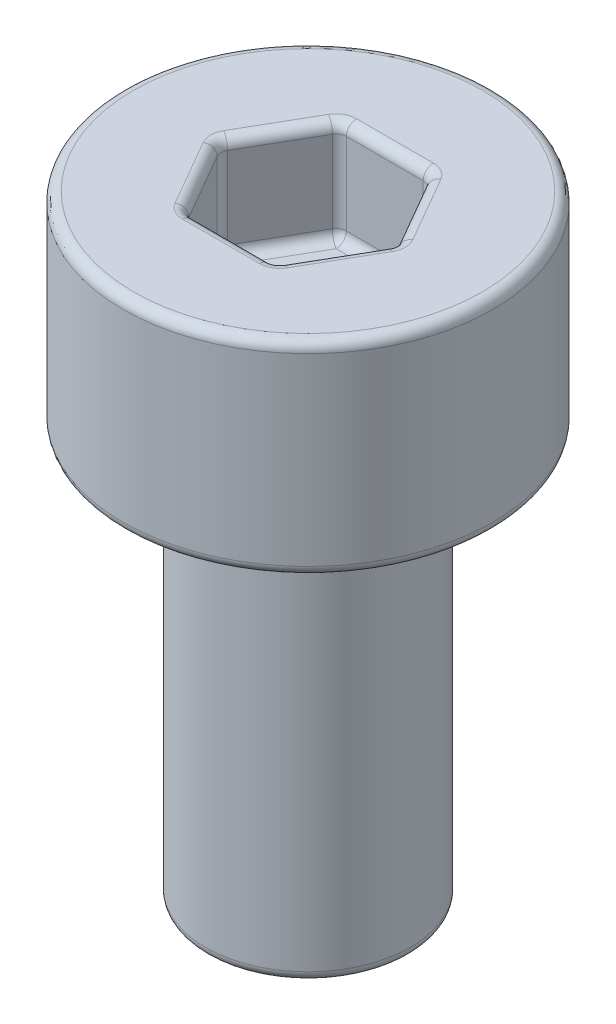
ISO-10303-21;
HEADER;
FILE_DESCRIPTION(('STEP AP214'),'2;1');
FILE_NAME('part.step','',(''),(''),'','','');
FILE_SCHEMA(('AUTOMOTIVE_DESIGN { 1 0 10303 214 1 1 1 1 }'));
ENDSEC;
DATA;
#1=APPLICATION_CONTEXT('core data for automotive mechanical design processes');
#2=APPLICATION_PROTOCOL_DEFINITION('international standard','automotive_design',2000,#1);
#3=PRODUCT_CONTEXT('',#1,'mechanical');
#4=PRODUCT('Part','Part','',(#3));
#5=PRODUCT_RELATED_PRODUCT_CATEGORY('part','',(#4));
#6=PRODUCT_DEFINITION_FORMATION('','',#4);
#7=PRODUCT_DEFINITION_CONTEXT('part definition',#1,'design');
#8=PRODUCT_DEFINITION('design','',#6,#7);
#9=PRODUCT_DEFINITION_SHAPE('','',#8);
#10=(LENGTH_UNIT() NAMED_UNIT(*) SI_UNIT(.MILLI.,.METRE.));
#11=(NAMED_UNIT(*) PLANE_ANGLE_UNIT() SI_UNIT($,.RADIAN.));
#12=(NAMED_UNIT(*) SI_UNIT($,.STERADIAN.) SOLID_ANGLE_UNIT());
#13=UNCERTAINTY_MEASURE_WITH_UNIT(LENGTH_MEASURE(1.E-05),#10,'distance_accuracy_value','');
#14=(GEOMETRIC_REPRESENTATION_CONTEXT(3) GLOBAL_UNCERTAINTY_ASSIGNED_CONTEXT((#13)) GLOBAL_UNIT_ASSIGNED_CONTEXT((#10,
#11,#12)) REPRESENTATION_CONTEXT('',''));
#15=CARTESIAN_POINT('',(0.,0.,0.));
#16=DIRECTION('',(0.,0.,1.));
#17=DIRECTION('',(1.,0.,0.));
#18=AXIS2_PLACEMENT_3D('',#15,#16,#17);
#19=CARTESIAN_POINT('',(0.,4.,0.));
#20=DIRECTION('',(0.,1.,0.));
#21=DIRECTION('',(0.,0.,1.));
#22=AXIS2_PLACEMENT_3D('',#19,#20,#21);
#23=PLANE('',#22);
#24=CARTESIAN_POINT('',(0.,4.,0.));
#25=DIRECTION('',(0.,1.,0.));
#26=DIRECTION('',(0.,0.,1.));
#27=AXIS2_PLACEMENT_3D('',#24,#25,#26);
#28=CIRCLE('',#27,3.41);
#29=CARTESIAN_POINT('',(0.,4.,3.41));
#30=VERTEX_POINT('',#29);
#31=EDGE_CURVE('E232',#30,#30,#28,.T.);
#32=ORIENTED_EDGE('',*,*,#31,.T.);
#33=EDGE_LOOP('',(#32));
#34=FACE_BOUND('',#33,.T.);
#35=CARTESIAN_POINT('',(0.750555349946514,4.,1.3));
#36=DIRECTION('',(0.,1.,0.));
#37=DIRECTION('',(0.,0.,1.));
#38=AXIS2_PLACEMENT_3D('',#35,#36,#37);
#39=CIRCLE('',#38,0.4);
#40=CARTESIAN_POINT('',(0.750555349946514,4.,1.7));
#41=VERTEX_POINT('',#40);
#42=CARTESIAN_POINT('',(1.09696551146029,4.,1.5));
#43=VERTEX_POINT('',#42);
#44=EDGE_CURVE('E262',#41,#43,#39,.T.);
#45=ORIENTED_EDGE('',*,*,#44,.F.);
#46=DIRECTION('',(1.,0.,0.));
#47=VECTOR('',#46,1.);
#48=CARTESIAN_POINT('',(-0.866025403784439,4.,1.7));
#49=LINE('',#48,#47);
#50=CARTESIAN_POINT('',(-0.750555349946514,4.,1.7));
#51=VERTEX_POINT('',#50);
#52=EDGE_CURVE('E260',#41,#51,#49,.F.);
#53=ORIENTED_EDGE('',*,*,#52,.T.);
#54=CARTESIAN_POINT('',(-0.750555349946514,4.,1.3));
#55=DIRECTION('',(0.,1.,0.));
#56=DIRECTION('',(0.,0.,1.));
#57=AXIS2_PLACEMENT_3D('',#54,#55,#56);
#58=CIRCLE('',#57,0.4);
#59=CARTESIAN_POINT('',(-1.09696551146029,4.,1.5));
#60=VERTEX_POINT('',#59);
#61=EDGE_CURVE('E257',#60,#51,#58,.T.);
#62=ORIENTED_EDGE('',*,*,#61,.F.);
#63=DIRECTION('',(0.5,0.,0.866025403784439));
#64=VECTOR('',#63,1.);
#65=CARTESIAN_POINT('',(-1.90525588832577,4.,0.1));
#66=LINE('',#65,#64);
#67=CARTESIAN_POINT('',(-1.8475208614068,4.,0.2));
#68=VERTEX_POINT('',#67);
#69=EDGE_CURVE('E249',#60,#68,#66,.F.);
#70=ORIENTED_EDGE('',*,*,#69,.T.);
#71=CARTESIAN_POINT('',(-1.50111069989303,4.,0.));
#72=DIRECTION('',(0.,1.,0.));
#73=DIRECTION('',(0.,0.,1.));
#74=AXIS2_PLACEMENT_3D('',#71,#72,#73);
#75=CIRCLE('',#74,0.4);
#76=CARTESIAN_POINT('',(-1.8475208614068,4.,-0.2));
#77=VERTEX_POINT('',#76);
#78=EDGE_CURVE('E247',#77,#68,#75,.T.);
#79=ORIENTED_EDGE('',*,*,#78,.F.);
#80=DIRECTION('',(-0.5,0.,0.866025403784439));
#81=VECTOR('',#80,1.);
#82=CARTESIAN_POINT('',(-1.03923048454133,4.,-1.6));
#83=LINE('',#82,#81);
#84=CARTESIAN_POINT('',(-1.09696551146029,4.,-1.5));
#85=VERTEX_POINT('',#84);
#86=EDGE_CURVE('E243',#77,#85,#83,.F.);
#87=ORIENTED_EDGE('',*,*,#86,.T.);
#88=CARTESIAN_POINT('',(-0.750555349946514,4.,-1.3));
#89=DIRECTION('',(0.,1.,0.));
#90=DIRECTION('',(0.,0.,1.));
#91=AXIS2_PLACEMENT_3D('',#88,#89,#90);
#92=CIRCLE('',#91,0.4);
#93=CARTESIAN_POINT('',(-0.750555349946514,4.,-1.7));
#94=VERTEX_POINT('',#93);
#95=EDGE_CURVE('E240',#94,#85,#92,.T.);
#96=ORIENTED_EDGE('',*,*,#95,.F.);
#97=DIRECTION('',(-1.,0.,0.));
#98=VECTOR('',#97,1.);
#99=CARTESIAN_POINT('',(0.866025403784438,4.,-1.7));
#100=LINE('',#99,#98);
#101=CARTESIAN_POINT('',(0.750555349946513,4.,-1.7));
#102=VERTEX_POINT('',#101);
#103=EDGE_CURVE('E238',#94,#102,#100,.F.);
#104=ORIENTED_EDGE('',*,*,#103,.T.);
#105=CARTESIAN_POINT('',(0.750555349946513,4.,-1.3));
#106=DIRECTION('',(0.,1.,0.));
#107=DIRECTION('',(0.,0.,1.));
#108=AXIS2_PLACEMENT_3D('',#105,#106,#107);
#109=CIRCLE('',#108,0.4);
#110=CARTESIAN_POINT('',(1.09696551146029,4.,-1.5));
#111=VERTEX_POINT('',#110);
#112=EDGE_CURVE('E235',#111,#102,#109,.T.);
#113=ORIENTED_EDGE('',*,*,#112,.F.);
#114=DIRECTION('',(-0.5,0.,-0.866025403784439));
#115=VECTOR('',#114,1.);
#116=CARTESIAN_POINT('',(1.90525588832576,4.,-0.1));
#117=LINE('',#116,#115);
#118=CARTESIAN_POINT('',(1.8475208614068,4.,-0.200000000000001));
#119=VERTEX_POINT('',#118);
#120=EDGE_CURVE('E245',#111,#119,#117,.F.);
#121=ORIENTED_EDGE('',*,*,#120,.T.);
#122=CARTESIAN_POINT('',(1.50111069989303,4.,0.));
#123=DIRECTION('',(0.,1.,0.));
#124=DIRECTION('',(0.,0.,1.));
#125=AXIS2_PLACEMENT_3D('',#122,#123,#124);
#126=CIRCLE('',#125,0.4);
#127=CARTESIAN_POINT('',(1.8475208614068,4.,0.199999999999999));
#128=VERTEX_POINT('',#127);
#129=EDGE_CURVE('E252',#128,#119,#126,.T.);
#130=ORIENTED_EDGE('',*,*,#129,.F.);
#131=DIRECTION('',(0.5,0.,-0.866025403784439));
#132=VECTOR('',#131,1.);
#133=CARTESIAN_POINT('',(1.03923048454133,4.,1.6));
#134=LINE('',#133,#132);
#135=EDGE_CURVE('E255',#128,#43,#134,.F.);
#136=ORIENTED_EDGE('',*,*,#135,.T.);
#137=EDGE_LOOP('',(#45,#53,#62,#70,#79,#87,#96,#104,#113,#121,#130,#136));
#138=FACE_BOUND('',#137,.T.);
#139=ADVANCED_FACE('F32',(#34,#138),#23,.T.);
#140=CARTESIAN_POINT('',(0.,-8.,0.));
#141=DIRECTION('',(0.,1.,0.));
#142=DIRECTION('',(0.,0.,1.));
#143=AXIS2_PLACEMENT_3D('',#140,#141,#142);
#144=CYLINDRICAL_SURFACE('',#143,2.);
#145=CARTESIAN_POINT('',(0.,-7.8,0.));
#146=DIRECTION('',(0.,1.,0.));
#147=DIRECTION('',(0.,0.,1.));
#148=AXIS2_PLACEMENT_3D('',#145,#146,#147);
#149=CIRCLE('',#148,2.);
#150=CARTESIAN_POINT('',(0.,-7.8,2.));
#151=VERTEX_POINT('',#150);
#152=EDGE_CURVE('E306',#151,#151,#149,.T.);
#153=ORIENTED_EDGE('',*,*,#152,.T.);
#154=EDGE_LOOP('',(#153));
#155=FACE_BOUND('',#154,.T.);
#156=CARTESIAN_POINT('',(0.,0.,0.));
#157=DIRECTION('',(0.,1.,0.));
#158=DIRECTION('',(0.,0.,1.));
#159=AXIS2_PLACEMENT_3D('',#156,#157,#158);
#160=CIRCLE('',#159,2.);
#161=CARTESIAN_POINT('',(0.,0.,2.));
#162=VERTEX_POINT('',#161);
#163=EDGE_CURVE('E211',#162,#162,#160,.T.);
#164=ORIENTED_EDGE('',*,*,#163,.F.);
#165=EDGE_LOOP('',(#164));
#166=FACE_BOUND('',#165,.T.);
#167=ADVANCED_FACE('F483',(#155,#166),#144,.T.);
#168=CARTESIAN_POINT('',(0.,-8.,0.));
#169=DIRECTION('',(0.,1.,0.));
#170=DIRECTION('',(0.,0.,1.));
#171=AXIS2_PLACEMENT_3D('',#168,#169,#170);
#172=PLANE('',#171);
#173=CARTESIAN_POINT('',(0.,-8.,0.));
#174=DIRECTION('',(0.,1.,0.));
#175=DIRECTION('',(0.,0.,1.));
#176=AXIS2_PLACEMENT_3D('',#173,#174,#175);
#177=CIRCLE('',#176,1.8);
#178=CARTESIAN_POINT('',(0.,-8.,1.8));
#179=VERTEX_POINT('',#178);
#180=EDGE_CURVE('E309',#179,#179,#177,.F.);
#181=ORIENTED_EDGE('',*,*,#180,.T.);
#182=EDGE_LOOP('',(#181));
#183=FACE_BOUND('',#182,.T.);
#184=ADVANCED_FACE('F489',(#183),#172,.F.);
#185=CARTESIAN_POINT('',(0.,4.,0.));
#186=DIRECTION('',(0.,-1.,0.));
#187=DIRECTION('',(0.,0.,-1.));
#188=AXIS2_PLACEMENT_3D('',#185,#186,#187);
#189=CYLINDRICAL_SURFACE('',#188,3.61);
#190=CARTESIAN_POINT('',(0.,0.2,0.));
#191=DIRECTION('',(0.,1.,0.));
#192=DIRECTION('',(0.,0.,1.));
#193=AXIS2_PLACEMENT_3D('',#190,#191,#192);
#194=CIRCLE('',#193,3.61);
#195=CARTESIAN_POINT('',(0.,0.2,3.61));
#196=VERTEX_POINT('',#195);
#197=EDGE_CURVE('E41',#196,#196,#194,.T.);
#198=ORIENTED_EDGE('',*,*,#197,.T.);
#199=EDGE_LOOP('',(#198));
#200=FACE_BOUND('',#199,.T.);
#201=CARTESIAN_POINT('',(0.,3.8,0.));
#202=DIRECTION('',(0.,1.,0.));
#203=DIRECTION('',(0.,0.,1.));
#204=AXIS2_PLACEMENT_3D('',#201,#202,#203);
#205=CIRCLE('',#204,3.61);
#206=CARTESIAN_POINT('',(0.,3.8,3.61));
#207=VERTEX_POINT('',#206);
#208=EDGE_CURVE('E312',#207,#207,#205,.F.);
#209=ORIENTED_EDGE('',*,*,#208,.T.);
#210=EDGE_LOOP('',(#209));
#211=FACE_BOUND('',#210,.T.);
#212=ADVANCED_FACE('F498',(#200,#211),#189,.T.);
#213=CARTESIAN_POINT('',(0.,0.,0.));
#214=DIRECTION('',(0.,1.,0.));
#215=DIRECTION('',(0.,0.,1.));
#216=AXIS2_PLACEMENT_3D('',#213,#214,#215);
#217=PLANE('',#216);
#218=CARTESIAN_POINT('',(0.,0.,0.));
#219=DIRECTION('',(0.,1.,0.));
#220=DIRECTION('',(0.,0.,1.));
#221=AXIS2_PLACEMENT_3D('',#218,#219,#220);
#222=CIRCLE('',#221,3.41);
#223=CARTESIAN_POINT('',(0.,0.,3.41));
#224=VERTEX_POINT('',#223);
#225=EDGE_CURVE('E11',#224,#224,#222,.F.);
#226=ORIENTED_EDGE('',*,*,#225,.T.);
#227=EDGE_LOOP('',(#226));
#228=FACE_BOUND('',#227,.T.);
#229=ORIENTED_EDGE('',*,*,#163,.T.);
#230=EDGE_LOOP('',(#229));
#231=FACE_BOUND('',#230,.T.);
#232=ADVANCED_FACE('F495',(#228,#231),#217,.F.);
#233=CARTESIAN_POINT('',(0.866025403784439,2.,1.5));
#234=DIRECTION('',(0.866025403784439,0.,0.499999999999999));
#235=DIRECTION('',(0.5,0.,-0.866025403784439));
#236=AXIS2_PLACEMENT_3D('',#233,#234,#235);
#237=PLANE('',#236);
#238=DIRECTION('',(0.5,0.,-0.866025403784439));
#239=VECTOR('',#238,1.);
#240=CARTESIAN_POINT('',(0.866025403784439,2.2,1.5));
#241=LINE('',#240,#239);
#242=CARTESIAN_POINT('',(1.67431578064991,2.2,0.0999999999999996));
#243=VERTEX_POINT('',#242);
#244=CARTESIAN_POINT('',(0.923760430703402,2.2,1.4));
#245=VERTEX_POINT('',#244);
#246=EDGE_CURVE('E278',#243,#245,#241,.F.);
#247=ORIENTED_EDGE('',*,*,#246,.T.);
#248=DIRECTION('',(0.,1.,0.));
#249=VECTOR('',#248,1.);
#250=CARTESIAN_POINT('',(0.923760430703402,4.,1.4));
#251=LINE('',#250,#249);
#252=CARTESIAN_POINT('',(0.923760430703402,3.8,1.4));
#253=VERTEX_POINT('',#252);
#254=EDGE_CURVE('E280',#245,#253,#251,.T.);
#255=ORIENTED_EDGE('',*,*,#254,.T.);
#256=DIRECTION('',(0.5,0.,-0.866025403784439));
#257=VECTOR('',#256,1.);
#258=CARTESIAN_POINT('',(1.73205080756888,3.8,0.));
#259=LINE('',#258,#257);
#260=CARTESIAN_POINT('',(1.67431578064991,3.8,0.0999999999999996));
#261=VERTEX_POINT('',#260);
#262=EDGE_CURVE('E276',#253,#261,#259,.T.);
#263=ORIENTED_EDGE('',*,*,#262,.T.);
#264=DIRECTION('',(0.,1.,0.));
#265=VECTOR('',#264,1.);
#266=CARTESIAN_POINT('',(1.67431578064991,2.,0.0999999999999996));
#267=LINE('',#266,#265);
#268=EDGE_CURVE('E274',#261,#243,#267,.F.);
#269=ORIENTED_EDGE('',*,*,#268,.T.);
#270=EDGE_LOOP('',(#247,#255,#263,#269));
#271=FACE_BOUND('',#270,.T.);
#272=ADVANCED_FACE('F494',(#271),#237,.F.);
#273=CARTESIAN_POINT('',(-0.866025403784439,2.,1.5));
#274=DIRECTION('',(0.,0.,1.));
#275=DIRECTION('',(1.,0.,0.));
#276=AXIS2_PLACEMENT_3D('',#273,#274,#275);
#277=PLANE('',#276);
#278=DIRECTION('',(1.,0.,0.));
#279=VECTOR('',#278,1.);
#280=CARTESIAN_POINT('',(-0.866025403784439,2.2,1.5));
#281=LINE('',#280,#279);
#282=CARTESIAN_POINT('',(0.750555349946514,2.2,1.5));
#283=VERTEX_POINT('',#282);
#284=CARTESIAN_POINT('',(-0.750555349946514,2.2,1.5));
#285=VERTEX_POINT('',#284);
#286=EDGE_CURVE('E269',#283,#285,#281,.F.);
#287=ORIENTED_EDGE('',*,*,#286,.T.);
#288=DIRECTION('',(0.,1.,0.));
#289=VECTOR('',#288,1.);
#290=CARTESIAN_POINT('',(-0.750555349946514,4.,1.5));
#291=LINE('',#290,#289);
#292=CARTESIAN_POINT('',(-0.750555349946514,3.8,1.5));
#293=VERTEX_POINT('',#292);
#294=EDGE_CURVE('E271',#285,#293,#291,.T.);
#295=ORIENTED_EDGE('',*,*,#294,.T.);
#296=DIRECTION('',(1.,0.,0.));
#297=VECTOR('',#296,1.);
#298=CARTESIAN_POINT('',(0.866025403784439,3.8,1.5));
#299=LINE('',#298,#297);
#300=CARTESIAN_POINT('',(0.750555349946514,3.8,1.5));
#301=VERTEX_POINT('',#300);
#302=EDGE_CURVE('E267',#293,#301,#299,.T.);
#303=ORIENTED_EDGE('',*,*,#302,.T.);
#304=DIRECTION('',(0.,1.,0.));
#305=VECTOR('',#304,1.);
#306=CARTESIAN_POINT('',(0.750555349946514,2.,1.5));
#307=LINE('',#306,#305);
#308=EDGE_CURVE('E265',#301,#283,#307,.F.);
#309=ORIENTED_EDGE('',*,*,#308,.T.);
#310=EDGE_LOOP('',(#287,#295,#303,#309));
#311=FACE_BOUND('',#310,.T.);
#312=ADVANCED_FACE('F835',(#311),#277,.F.);
#313=CARTESIAN_POINT('',(-1.73205080756888,2.,0.));
#314=DIRECTION('',(-0.866025403784439,0.,0.5));
#315=DIRECTION('',(0.5,0.,0.866025403784439));
#316=AXIS2_PLACEMENT_3D('',#313,#314,#315);
#317=PLANE('',#316);
#318=DIRECTION('',(0.5,0.,0.866025403784439));
#319=VECTOR('',#318,1.);
#320=CARTESIAN_POINT('',(-0.866025403784439,3.8,1.5));
#321=LINE('',#320,#319);
#322=CARTESIAN_POINT('',(-1.67431578064992,3.8,0.1));
#323=VERTEX_POINT('',#322);
#324=CARTESIAN_POINT('',(-0.923760430703402,3.8,1.4));
#325=VERTEX_POINT('',#324);
#326=EDGE_CURVE('E225',#323,#325,#321,.T.);
#327=ORIENTED_EDGE('',*,*,#326,.T.);
#328=DIRECTION('',(0.,1.,0.));
#329=VECTOR('',#328,1.);
#330=CARTESIAN_POINT('',(-0.923760430703402,2.,1.4));
#331=LINE('',#330,#329);
#332=CARTESIAN_POINT('',(-0.923760430703402,2.2,1.4));
#333=VERTEX_POINT('',#332);
#334=EDGE_CURVE('E230',#325,#333,#331,.F.);
#335=ORIENTED_EDGE('',*,*,#334,.T.);
#336=DIRECTION('',(0.5,0.,0.866025403784439));
#337=VECTOR('',#336,1.);
#338=CARTESIAN_POINT('',(-1.73205080756888,2.2,0.));
#339=LINE('',#338,#337);
#340=CARTESIAN_POINT('',(-1.67431578064992,2.2,0.1));
#341=VERTEX_POINT('',#340);
#342=EDGE_CURVE('E227',#333,#341,#339,.F.);
#343=ORIENTED_EDGE('',*,*,#342,.T.);
#344=DIRECTION('',(0.,1.,0.));
#345=VECTOR('',#344,1.);
#346=CARTESIAN_POINT('',(-1.67431578064992,4.,0.1));
#347=LINE('',#346,#345);
#348=EDGE_CURVE('E223',#341,#323,#347,.T.);
#349=ORIENTED_EDGE('',*,*,#348,.T.);
#350=EDGE_LOOP('',(#327,#335,#343,#349));
#351=FACE_BOUND('',#350,.T.);
#352=ADVANCED_FACE('F479',(#351),#317,.F.);
#353=CARTESIAN_POINT('',(-0.866025403784439,2.,-1.5));
#354=DIRECTION('',(-0.866025403784439,0.,-0.5));
#355=DIRECTION('',(-0.5,0.,0.866025403784439));
#356=AXIS2_PLACEMENT_3D('',#353,#354,#355);
#357=PLANE('',#356);
#358=DIRECTION('',(0.,1.,0.));
#359=VECTOR('',#358,1.);
#360=CARTESIAN_POINT('',(-1.67431578064992,2.,-0.0999999999999996));
#361=LINE('',#360,#359);
#362=CARTESIAN_POINT('',(-1.67431578064992,3.8,-0.0999999999999996));
#363=VERTEX_POINT('',#362);
#364=CARTESIAN_POINT('',(-1.67431578064992,2.2,-0.0999999999999996));
#365=VERTEX_POINT('',#364);
#366=EDGE_CURVE('E295',#363,#365,#361,.F.);
#367=ORIENTED_EDGE('',*,*,#366,.T.);
#368=DIRECTION('',(-0.5,0.,0.866025403784439));
#369=VECTOR('',#368,1.);
#370=CARTESIAN_POINT('',(-0.866025403784439,2.2,-1.5));
#371=LINE('',#370,#369);
#372=CARTESIAN_POINT('',(-0.923760430703402,2.2,-1.4));
#373=VERTEX_POINT('',#372);
#374=EDGE_CURVE('E297',#365,#373,#371,.F.);
#375=ORIENTED_EDGE('',*,*,#374,.T.);
#376=DIRECTION('',(0.,1.,0.));
#377=VECTOR('',#376,1.);
#378=CARTESIAN_POINT('',(-0.923760430703402,4.,-1.4));
#379=LINE('',#378,#377);
#380=CARTESIAN_POINT('',(-0.923760430703402,3.8,-1.4));
#381=VERTEX_POINT('',#380);
#382=EDGE_CURVE('E291',#373,#381,#379,.T.);
#383=ORIENTED_EDGE('',*,*,#382,.T.);
#384=DIRECTION('',(-0.5,0.,0.866025403784439));
#385=VECTOR('',#384,1.);
#386=CARTESIAN_POINT('',(-1.73205080756888,3.8,0.));
#387=LINE('',#386,#385);
#388=EDGE_CURVE('E293',#381,#363,#387,.T.);
#389=ORIENTED_EDGE('',*,*,#388,.T.);
#390=EDGE_LOOP('',(#367,#375,#383,#389));
#391=FACE_BOUND('',#390,.T.);
#392=ADVANCED_FACE('F472',(#391),#357,.F.);
#393=CARTESIAN_POINT('',(0.866025403784438,2.,-1.5));
#394=DIRECTION('',(0.,0.,-1.));
#395=DIRECTION('',(-1.,0.,0.));
#396=AXIS2_PLACEMENT_3D('',#393,#394,#395);
#397=PLANE('',#396);
#398=DIRECTION('',(-1.,0.,0.));
#399=VECTOR('',#398,1.);
#400=CARTESIAN_POINT('',(0.866025403784438,2.2,-1.5));
#401=LINE('',#400,#399);
#402=CARTESIAN_POINT('',(-0.750555349946514,2.2,-1.5));
#403=VERTEX_POINT('',#402);
#404=CARTESIAN_POINT('',(0.750555349946513,2.2,-1.5));
#405=VERTEX_POINT('',#404);
#406=EDGE_CURVE('E49',#403,#405,#401,.F.);
#407=ORIENTED_EDGE('',*,*,#406,.T.);
#408=DIRECTION('',(0.,1.,0.));
#409=VECTOR('',#408,1.);
#410=CARTESIAN_POINT('',(0.750555349946513,4.,-1.5));
#411=LINE('',#410,#409);
#412=CARTESIAN_POINT('',(0.750555349946513,3.8,-1.5));
#413=VERTEX_POINT('',#412);
#414=EDGE_CURVE('E304',#405,#413,#411,.T.);
#415=ORIENTED_EDGE('',*,*,#414,.T.);
#416=DIRECTION('',(-1.,0.,0.));
#417=VECTOR('',#416,1.);
#418=CARTESIAN_POINT('',(-0.866025403784439,3.8,-1.5));
#419=LINE('',#418,#417);
#420=CARTESIAN_POINT('',(-0.750555349946514,3.8,-1.5));
#421=VERTEX_POINT('',#420);
#422=EDGE_CURVE('E300',#413,#421,#419,.T.);
#423=ORIENTED_EDGE('',*,*,#422,.T.);
#424=DIRECTION('',(0.,1.,0.));
#425=VECTOR('',#424,1.);
#426=CARTESIAN_POINT('',(-0.750555349946514,2.,-1.5));
#427=LINE('',#426,#425);
#428=EDGE_CURVE('E54',#421,#403,#427,.F.);
#429=ORIENTED_EDGE('',*,*,#428,.T.);
#430=EDGE_LOOP('',(#407,#415,#423,#429));
#431=FACE_BOUND('',#430,.T.);
#432=ADVANCED_FACE('F470',(#431),#397,.F.);
#433=CARTESIAN_POINT('',(1.73205080756888,2.,0.));
#434=DIRECTION('',(0.866025403784439,0.,-0.5));
#435=DIRECTION('',(-0.5,0.,-0.866025403784439));
#436=AXIS2_PLACEMENT_3D('',#433,#434,#435);
#437=PLANE('',#436);
#438=DIRECTION('',(-0.5,0.,-0.866025403784439));
#439=VECTOR('',#438,1.);
#440=CARTESIAN_POINT('',(1.73205080756888,2.2,0.));
#441=LINE('',#440,#439);
#442=CARTESIAN_POINT('',(0.923760430703401,2.2,-1.4));
#443=VERTEX_POINT('',#442);
#444=CARTESIAN_POINT('',(1.67431578064991,2.2,-0.100000000000001));
#445=VERTEX_POINT('',#444);
#446=EDGE_CURVE('E193',#443,#445,#441,.F.);
#447=ORIENTED_EDGE('',*,*,#446,.T.);
#448=DIRECTION('',(0.,1.,0.));
#449=VECTOR('',#448,1.);
#450=CARTESIAN_POINT('',(1.67431578064991,4.,-0.1));
#451=LINE('',#450,#449);
#452=CARTESIAN_POINT('',(1.67431578064991,3.8,-0.100000000000001));
#453=VERTEX_POINT('',#452);
#454=EDGE_CURVE('E288',#445,#453,#451,.T.);
#455=ORIENTED_EDGE('',*,*,#454,.T.);
#456=DIRECTION('',(-0.5,0.,-0.866025403784439));
#457=VECTOR('',#456,1.);
#458=CARTESIAN_POINT('',(0.866025403784438,3.8,-1.5));
#459=LINE('',#458,#457);
#460=CARTESIAN_POINT('',(0.923760430703401,3.8,-1.4));
#461=VERTEX_POINT('',#460);
#462=EDGE_CURVE('E285',#453,#461,#459,.T.);
#463=ORIENTED_EDGE('',*,*,#462,.T.);
#464=DIRECTION('',(0.,1.,0.));
#465=VECTOR('',#464,1.);
#466=CARTESIAN_POINT('',(0.923760430703401,2.,-1.4));
#467=LINE('',#466,#465);
#468=EDGE_CURVE('E283',#461,#443,#467,.F.);
#469=ORIENTED_EDGE('',*,*,#468,.T.);
#470=EDGE_LOOP('',(#447,#455,#463,#469));
#471=FACE_BOUND('',#470,.T.);
#472=ADVANCED_FACE('F467',(#471),#437,.F.);
#473=CARTESIAN_POINT('',(0.,2.,0.));
#474=DIRECTION('',(0.,1.,0.));
#475=DIRECTION('',(0.,0.,1.));
#476=AXIS2_PLACEMENT_3D('',#473,#474,#475);
#477=PLANE('',#476);
#478=DIRECTION('',(-0.5,0.,0.866025403784439));
#479=VECTOR('',#478,1.);
#480=CARTESIAN_POINT('',(-1.12583302491977,2.,-0.65));
#481=LINE('',#480,#479);
#482=CARTESIAN_POINT('',(-0.750555349946514,2.,-1.3));
#483=VERTEX_POINT('',#482);
#484=CARTESIAN_POINT('',(-1.50111069989303,2.,0.));
#485=VERTEX_POINT('',#484);
#486=EDGE_CURVE('E186',#483,#485,#481,.T.);
#487=ORIENTED_EDGE('',*,*,#486,.T.);
#488=DIRECTION('',(0.5,0.,0.866025403784439));
#489=VECTOR('',#488,1.);
#490=CARTESIAN_POINT('',(-1.12583302491977,2.,0.65));
#491=LINE('',#490,#489);
#492=CARTESIAN_POINT('',(-0.750555349946514,2.,1.3));
#493=VERTEX_POINT('',#492);
#494=EDGE_CURVE('E220',#485,#493,#491,.T.);
#495=ORIENTED_EDGE('',*,*,#494,.T.);
#496=DIRECTION('',(1.,0.,0.));
#497=VECTOR('',#496,1.);
#498=CARTESIAN_POINT('',(0.,2.,1.3));
#499=LINE('',#498,#497);
#500=CARTESIAN_POINT('',(0.750555349946514,2.,1.3));
#501=VERTEX_POINT('',#500);
#502=EDGE_CURVE('E218',#493,#501,#499,.T.);
#503=ORIENTED_EDGE('',*,*,#502,.T.);
#504=DIRECTION('',(0.5,0.,-0.866025403784439));
#505=VECTOR('',#504,1.);
#506=CARTESIAN_POINT('',(1.12583302491977,2.,0.649999999999999));
#507=LINE('',#506,#505);
#508=CARTESIAN_POINT('',(1.50111069989303,2.,0.));
#509=VERTEX_POINT('',#508);
#510=EDGE_CURVE('E182',#501,#509,#507,.T.);
#511=ORIENTED_EDGE('',*,*,#510,.T.);
#512=DIRECTION('',(-0.5,0.,-0.866025403784439));
#513=VECTOR('',#512,1.);
#514=CARTESIAN_POINT('',(1.12583302491977,2.,-0.65));
#515=LINE('',#514,#513);
#516=CARTESIAN_POINT('',(0.750555349946513,2.,-1.3));
#517=VERTEX_POINT('',#516);
#518=EDGE_CURVE('E175',#509,#517,#515,.T.);
#519=ORIENTED_EDGE('',*,*,#518,.T.);
#520=DIRECTION('',(-1.,0.,0.));
#521=VECTOR('',#520,1.);
#522=CARTESIAN_POINT('',(0.,2.,-1.3));
#523=LINE('',#522,#521);
#524=EDGE_CURVE('E179',#517,#483,#523,.T.);
#525=ORIENTED_EDGE('',*,*,#524,.T.);
#526=EDGE_LOOP('',(#487,#495,#503,#511,#519,#525));
#527=FACE_BOUND('',#526,.T.);
#528=ADVANCED_FACE('F177',(#527),#477,.T.);
#529=CARTESIAN_POINT('',(1.90525588832576,3.8,-0.1));
#530=DIRECTION('',(0.5,0.,0.866025403784439));
#531=DIRECTION('',(0.866025403784439,0.,-0.5));
#532=AXIS2_PLACEMENT_3D('',#529,#530,#531);
#533=CYLINDRICAL_SURFACE('',#532,0.2);
#534=CARTESIAN_POINT('',(1.8475208614068,3.8,-0.200000000000001));
#535=DIRECTION('',(0.5,0.,0.866025403784439));
#536=DIRECTION('',(0.866025403784439,0.,-0.5));
#537=AXIS2_PLACEMENT_3D('',#534,#535,#536);
#538=CIRCLE('',#537,0.2);
#539=EDGE_CURVE('E398',#119,#453,#538,.T.);
#540=ORIENTED_EDGE('',*,*,#539,.F.);
#541=ORIENTED_EDGE('',*,*,#120,.F.);
#542=CARTESIAN_POINT('',(1.09696551146029,3.8,-1.5));
#543=DIRECTION('',(-0.5,0.,-0.866025403784439));
#544=DIRECTION('',(-0.866025403784439,0.,0.5));
#545=AXIS2_PLACEMENT_3D('',#542,#543,#544);
#546=CIRCLE('',#545,0.2);
#547=EDGE_CURVE('E36',#461,#111,#546,.T.);
#548=ORIENTED_EDGE('',*,*,#547,.F.);
#549=ORIENTED_EDGE('',*,*,#462,.F.);
#550=EDGE_LOOP('',(#540,#541,#548,#549));
#551=FACE_BOUND('',#550,.T.);
#552=ADVANCED_FACE('F413',(#551),#533,.T.);
#553=CARTESIAN_POINT('',(0.750555349946513,3.8,-1.3));
#554=DIRECTION('',(0.,1.,0.));
#555=DIRECTION('',(0.,0.,1.));
#556=AXIS2_PLACEMENT_3D('',#553,#554,#555);
#557=TOROIDAL_SURFACE('',#556,0.4,0.2);
#558=ORIENTED_EDGE('',*,*,#547,.T.);
#559=ORIENTED_EDGE('',*,*,#112,.T.);
#560=CARTESIAN_POINT('',(0.750555349946513,3.8,-1.7));
#561=DIRECTION('',(1.,0.,0.));
#562=DIRECTION('',(0.,0.,-1.));
#563=AXIS2_PLACEMENT_3D('',#560,#561,#562);
#564=CIRCLE('',#563,0.2);
#565=EDGE_CURVE('E396',#413,#102,#564,.F.);
#566=ORIENTED_EDGE('',*,*,#565,.F.);
#567=CARTESIAN_POINT('',(0.750555349946513,3.8,-1.3));
#568=DIRECTION('',(0.,1.,0.));
#569=DIRECTION('',(0.,0.,1.));
#570=AXIS2_PLACEMENT_3D('',#567,#568,#569);
#571=CIRCLE('',#570,0.2);
#572=EDGE_CURVE('E393',#461,#413,#571,.T.);
#573=ORIENTED_EDGE('',*,*,#572,.F.);
#574=EDGE_LOOP('',(#558,#559,#566,#573));
#575=FACE_BOUND('',#574,.T.);
#576=ADVANCED_FACE('F408',(#575),#557,.T.);
#577=CARTESIAN_POINT('',(1.50111069989303,3.8,0.));
#578=DIRECTION('',(0.,1.,0.));
#579=DIRECTION('',(0.,0.,1.));
#580=AXIS2_PLACEMENT_3D('',#577,#578,#579);
#581=TOROIDAL_SURFACE('',#580,0.4,0.2);
#582=ORIENTED_EDGE('',*,*,#129,.T.);
#583=ORIENTED_EDGE('',*,*,#539,.T.);
#584=CARTESIAN_POINT('',(1.50111069989303,3.8,0.));
#585=DIRECTION('',(0.,1.,0.));
#586=DIRECTION('',(0.,0.,1.));
#587=AXIS2_PLACEMENT_3D('',#584,#585,#586);
#588=CIRCLE('',#587,0.2);
#589=EDGE_CURVE('E391',#261,#453,#588,.T.);
#590=ORIENTED_EDGE('',*,*,#589,.F.);
#591=CARTESIAN_POINT('',(1.8475208614068,3.8,0.199999999999999));
#592=DIRECTION('',(0.5,0.,-0.866025403784439));
#593=DIRECTION('',(-0.866025403784439,0.,-0.5));
#594=AXIS2_PLACEMENT_3D('',#591,#592,#593);
#595=CIRCLE('',#594,0.2);
#596=EDGE_CURVE('E388',#128,#261,#595,.F.);
#597=ORIENTED_EDGE('',*,*,#596,.F.);
#598=EDGE_LOOP('',(#582,#583,#590,#597));
#599=FACE_BOUND('',#598,.T.);
#600=ADVANCED_FACE('F583',(#599),#581,.T.);
#601=CARTESIAN_POINT('',(0.866025403784438,3.8,-1.7));
#602=DIRECTION('',(1.,0.,0.));
#603=DIRECTION('',(0.,0.,-1.));
#604=AXIS2_PLACEMENT_3D('',#601,#602,#603);
#605=CYLINDRICAL_SURFACE('',#604,0.2);
#606=ORIENTED_EDGE('',*,*,#565,.T.);
#607=ORIENTED_EDGE('',*,*,#103,.F.);
#608=CARTESIAN_POINT('',(-0.750555349946514,3.8,-1.7));
#609=DIRECTION('',(-1.,0.,0.));
#610=DIRECTION('',(0.,0.,1.));
#611=AXIS2_PLACEMENT_3D('',#608,#609,#610);
#612=CIRCLE('',#611,0.2);
#613=EDGE_CURVE('E385',#421,#94,#612,.T.);
#614=ORIENTED_EDGE('',*,*,#613,.F.);
#615=ORIENTED_EDGE('',*,*,#422,.F.);
#616=EDGE_LOOP('',(#606,#607,#614,#615));
#617=FACE_BOUND('',#616,.T.);
#618=ADVANCED_FACE('F419',(#617),#605,.T.);
#619=CARTESIAN_POINT('',(0.750555349946513,2.,-1.3));
#620=DIRECTION('',(0.,-1.,0.));
#621=DIRECTION('',(0.,0.,-1.));
#622=AXIS2_PLACEMENT_3D('',#619,#620,#621);
#623=CYLINDRICAL_SURFACE('',#622,0.2);
#624=ORIENTED_EDGE('',*,*,#572,.T.);
#625=ORIENTED_EDGE('',*,*,#414,.F.);
#626=CARTESIAN_POINT('',(0.750555349946513,2.2,-1.3));
#627=DIRECTION('',(0.,1.,0.));
#628=DIRECTION('',(0.,0.,1.));
#629=AXIS2_PLACEMENT_3D('',#626,#627,#628);
#630=CIRCLE('',#629,0.2);
#631=EDGE_CURVE('E197',#443,#405,#630,.T.);
#632=ORIENTED_EDGE('',*,*,#631,.F.);
#633=ORIENTED_EDGE('',*,*,#468,.F.);
#634=EDGE_LOOP('',(#624,#625,#632,#633));
#635=FACE_BOUND('',#634,.T.);
#636=ADVANCED_FACE('F469',(#635),#623,.F.);
#637=CARTESIAN_POINT('',(1.12583302491977,2.2,-0.65));
#638=DIRECTION('',(-0.5,0.,-0.866025403784439));
#639=DIRECTION('',(-0.866025403784439,0.,0.5));
#640=AXIS2_PLACEMENT_3D('',#637,#638,#639);
#641=CYLINDRICAL_SURFACE('',#640,0.2);
#642=CARTESIAN_POINT('',(1.50111069989303,2.2,0.));
#643=DIRECTION('',(-0.5,0.,-0.866025403784439));
#644=DIRECTION('',(-0.866025403784439,0.,0.5));
#645=AXIS2_PLACEMENT_3D('',#642,#643,#644);
#646=CIRCLE('',#645,0.2);
#647=EDGE_CURVE('E198',#445,#509,#646,.T.);
#648=ORIENTED_EDGE('',*,*,#647,.F.);
#649=ORIENTED_EDGE('',*,*,#446,.F.);
#650=CARTESIAN_POINT('',(0.750555349946513,2.2,-1.3));
#651=DIRECTION('',(0.5,0.,0.866025403784438));
#652=DIRECTION('',(0.866025403784438,0.,-0.5));
#653=AXIS2_PLACEMENT_3D('',#650,#651,#652);
#654=CIRCLE('',#653,0.2);
#655=EDGE_CURVE('E190',#517,#443,#654,.T.);
#656=ORIENTED_EDGE('',*,*,#655,.F.);
#657=ORIENTED_EDGE('',*,*,#518,.F.);
#658=EDGE_LOOP('',(#648,#649,#656,#657));
#659=FACE_BOUND('',#658,.T.);
#660=ADVANCED_FACE('F192',(#659),#641,.F.);
#661=CARTESIAN_POINT('',(1.50111069989303,2.,0.));
#662=DIRECTION('',(0.,-1.,0.));
#663=DIRECTION('',(0.,0.,-1.));
#664=AXIS2_PLACEMENT_3D('',#661,#662,#663);
#665=CYLINDRICAL_SURFACE('',#664,0.2);
#666=ORIENTED_EDGE('',*,*,#589,.T.);
#667=ORIENTED_EDGE('',*,*,#454,.F.);
#668=CARTESIAN_POINT('',(1.50111069989303,2.2,0.));
#669=DIRECTION('',(0.,1.,0.));
#670=DIRECTION('',(0.,0.,1.));
#671=AXIS2_PLACEMENT_3D('',#668,#669,#670);
#672=CIRCLE('',#671,0.2);
#673=EDGE_CURVE('E380',#243,#445,#672,.T.);
#674=ORIENTED_EDGE('',*,*,#673,.F.);
#675=ORIENTED_EDGE('',*,*,#268,.F.);
#676=EDGE_LOOP('',(#666,#667,#674,#675));
#677=FACE_BOUND('',#676,.T.);
#678=ADVANCED_FACE('F465',(#677),#665,.F.);
#679=CARTESIAN_POINT('',(1.03923048454133,3.8,1.6));
#680=DIRECTION('',(-0.5,0.,0.866025403784439));
#681=DIRECTION('',(0.866025403784439,0.,0.499999999999999));
#682=AXIS2_PLACEMENT_3D('',#679,#680,#681);
#683=CYLINDRICAL_SURFACE('',#682,0.2);
#684=ORIENTED_EDGE('',*,*,#596,.T.);
#685=ORIENTED_EDGE('',*,*,#262,.F.);
#686=CARTESIAN_POINT('',(1.09696551146029,3.8,1.5));
#687=DIRECTION('',(-0.499999999999999,0.,0.866025403784439));
#688=DIRECTION('',(0.866025403784439,0.,0.499999999999999));
#689=AXIS2_PLACEMENT_3D('',#686,#687,#688);
#690=CIRCLE('',#689,0.2);
#691=EDGE_CURVE('E377',#43,#253,#690,.T.);
#692=ORIENTED_EDGE('',*,*,#691,.F.);
#693=ORIENTED_EDGE('',*,*,#135,.F.);
#694=EDGE_LOOP('',(#684,#685,#692,#693));
#695=FACE_BOUND('',#694,.T.);
#696=ADVANCED_FACE('F571',(#695),#683,.T.);
#697=CARTESIAN_POINT('',(-0.750555349946514,3.8,-1.3));
#698=DIRECTION('',(0.,1.,0.));
#699=DIRECTION('',(0.,0.,1.));
#700=AXIS2_PLACEMENT_3D('',#697,#698,#699);
#701=TOROIDAL_SURFACE('',#700,0.4,0.2);
#702=ORIENTED_EDGE('',*,*,#613,.T.);
#703=ORIENTED_EDGE('',*,*,#95,.T.);
#704=CARTESIAN_POINT('',(-1.09696551146029,3.8,-1.5));
#705=DIRECTION('',(0.5,0.,-0.866025403784438));
#706=DIRECTION('',(-0.866025403784439,0.,-0.5));
#707=AXIS2_PLACEMENT_3D('',#704,#705,#706);
#708=CIRCLE('',#707,0.2);
#709=EDGE_CURVE('E374',#381,#85,#708,.F.);
#710=ORIENTED_EDGE('',*,*,#709,.F.);
#711=CARTESIAN_POINT('',(-0.750555349946514,3.8,-1.3));
#712=DIRECTION('',(0.,1.,0.));
#713=DIRECTION('',(0.,0.,1.));
#714=AXIS2_PLACEMENT_3D('',#711,#712,#713);
#715=CIRCLE('',#714,0.2);
#716=EDGE_CURVE('E204',#421,#381,#715,.T.);
#717=ORIENTED_EDGE('',*,*,#716,.F.);
#718=EDGE_LOOP('',(#702,#703,#710,#717));
#719=FACE_BOUND('',#718,.T.);
#720=ADVANCED_FACE('F422',(#719),#701,.T.);
#721=CARTESIAN_POINT('',(0.750555349946513,2.2,-1.3));
#722=DIRECTION('',(0.,0.,1.));
#723=DIRECTION('',(1.,0.,0.));
#724=AXIS2_PLACEMENT_3D('',#721,#722,#723);
#725=SPHERICAL_SURFACE('',#724,0.2);
#726=ORIENTED_EDGE('',*,*,#655,.T.);
#727=ORIENTED_EDGE('',*,*,#631,.T.);
#728=CARTESIAN_POINT('',(0.750555349946513,2.2,-1.3));
#729=DIRECTION('',(-1.,0.,0.));
#730=DIRECTION('',(0.,-1.,0.));
#731=AXIS2_PLACEMENT_3D('',#728,#729,#730);
#732=CIRCLE('',#731,0.2);
#733=EDGE_CURVE('E201',#517,#405,#732,.F.);
#734=ORIENTED_EDGE('',*,*,#733,.F.);
#735=EDGE_LOOP('',(#726,#727,#734));
#736=FACE_BOUND('',#735,.T.);
#737=ADVANCED_FACE('F202',(#736),#725,.F.);
#738=CARTESIAN_POINT('',(1.50111069989303,2.2,0.));
#739=DIRECTION('',(0.,0.,1.));
#740=DIRECTION('',(1.,0.,0.));
#741=AXIS2_PLACEMENT_3D('',#738,#739,#740);
#742=SPHERICAL_SURFACE('',#741,0.2);
#743=ORIENTED_EDGE('',*,*,#673,.T.);
#744=ORIENTED_EDGE('',*,*,#647,.T.);
#745=CARTESIAN_POINT('',(1.50111069989303,2.2,0.));
#746=DIRECTION('',(-0.5,0.,0.866025403784438));
#747=DIRECTION('',(0.866025403784439,0.,0.5));
#748=AXIS2_PLACEMENT_3D('',#745,#746,#747);
#749=CIRCLE('',#748,0.2);
#750=EDGE_CURVE('E205',#243,#509,#749,.F.);
#751=ORIENTED_EDGE('',*,*,#750,.F.);
#752=EDGE_LOOP('',(#743,#744,#751));
#753=FACE_BOUND('',#752,.T.);
#754=ADVANCED_FACE('F460',(#753),#742,.F.);
#755=CARTESIAN_POINT('',(0.750555349946514,3.8,1.3));
#756=DIRECTION('',(0.,1.,0.));
#757=DIRECTION('',(0.,0.,1.));
#758=AXIS2_PLACEMENT_3D('',#755,#756,#757);
#759=TOROIDAL_SURFACE('',#758,0.4,0.2);
#760=ORIENTED_EDGE('',*,*,#44,.T.);
#761=ORIENTED_EDGE('',*,*,#691,.T.);
#762=CARTESIAN_POINT('',(0.750555349946514,3.8,1.3));
#763=DIRECTION('',(0.,1.,0.));
#764=DIRECTION('',(0.,0.,1.));
#765=AXIS2_PLACEMENT_3D('',#762,#763,#764);
#766=CIRCLE('',#765,0.2);
#767=EDGE_CURVE('E368',#301,#253,#766,.T.);
#768=ORIENTED_EDGE('',*,*,#767,.F.);
#769=CARTESIAN_POINT('',(0.750555349946514,3.8,1.7));
#770=DIRECTION('',(1.,0.,0.));
#771=DIRECTION('',(0.,0.,-1.));
#772=AXIS2_PLACEMENT_3D('',#769,#770,#771);
#773=CIRCLE('',#772,0.2);
#774=EDGE_CURVE('E365',#41,#301,#773,.F.);
#775=ORIENTED_EDGE('',*,*,#774,.F.);
#776=EDGE_LOOP('',(#760,#761,#768,#775));
#777=FACE_BOUND('',#776,.T.);
#778=ADVANCED_FACE('F560',(#777),#759,.T.);
#779=CARTESIAN_POINT('',(-1.03923048454133,3.8,-1.6));
#780=DIRECTION('',(0.5,0.,-0.866025403784439));
#781=DIRECTION('',(-0.866025403784439,0.,-0.5));
#782=AXIS2_PLACEMENT_3D('',#779,#780,#781);
#783=CYLINDRICAL_SURFACE('',#782,0.2);
#784=ORIENTED_EDGE('',*,*,#709,.T.);
#785=ORIENTED_EDGE('',*,*,#86,.F.);
#786=CARTESIAN_POINT('',(-1.8475208614068,3.8,-0.2));
#787=DIRECTION('',(-0.5,0.,0.866025403784439));
#788=DIRECTION('',(0.866025403784439,0.,0.5));
#789=AXIS2_PLACEMENT_3D('',#786,#787,#788);
#790=CIRCLE('',#789,0.2);
#791=EDGE_CURVE('E359',#363,#77,#790,.T.);
#792=ORIENTED_EDGE('',*,*,#791,.F.);
#793=ORIENTED_EDGE('',*,*,#388,.F.);
#794=EDGE_LOOP('',(#784,#785,#792,#793));
#795=FACE_BOUND('',#794,.T.);
#796=ADVANCED_FACE('F557',(#795),#783,.T.);
#797=CARTESIAN_POINT('',(-0.750555349946514,2.,-1.3));
#798=DIRECTION('',(0.,-1.,0.));
#799=DIRECTION('',(0.,0.,-1.));
#800=AXIS2_PLACEMENT_3D('',#797,#798,#799);
#801=CYLINDRICAL_SURFACE('',#800,0.2);
#802=ORIENTED_EDGE('',*,*,#716,.T.);
#803=ORIENTED_EDGE('',*,*,#382,.F.);
#804=CARTESIAN_POINT('',(-0.750555349946514,2.2,-1.3));
#805=DIRECTION('',(0.,1.,0.));
#806=DIRECTION('',(0.,0.,1.));
#807=AXIS2_PLACEMENT_3D('',#804,#805,#806);
#808=CIRCLE('',#807,0.2);
#809=EDGE_CURVE('E356',#403,#373,#808,.T.);
#810=ORIENTED_EDGE('',*,*,#809,.F.);
#811=ORIENTED_EDGE('',*,*,#428,.F.);
#812=EDGE_LOOP('',(#802,#803,#810,#811));
#813=FACE_BOUND('',#812,.T.);
#814=ADVANCED_FACE('F428',(#813),#801,.F.);
#815=CARTESIAN_POINT('',(0.,2.2,-1.3));
#816=DIRECTION('',(-1.,0.,0.));
#817=DIRECTION('',(0.,0.,1.));
#818=AXIS2_PLACEMENT_3D('',#815,#816,#817);
#819=CYLINDRICAL_SURFACE('',#818,0.2);
#820=ORIENTED_EDGE('',*,*,#733,.T.);
#821=ORIENTED_EDGE('',*,*,#406,.F.);
#822=CARTESIAN_POINT('',(-0.750555349946514,2.2,-1.3));
#823=DIRECTION('',(1.,0.,0.));
#824=DIRECTION('',(0.,0.,-1.));
#825=AXIS2_PLACEMENT_3D('',#822,#823,#824);
#826=CIRCLE('',#825,0.2);
#827=EDGE_CURVE('E209',#483,#403,#826,.T.);
#828=ORIENTED_EDGE('',*,*,#827,.F.);
#829=ORIENTED_EDGE('',*,*,#524,.F.);
#830=EDGE_LOOP('',(#820,#821,#828,#829));
#831=FACE_BOUND('',#830,.T.);
#832=ADVANCED_FACE('F207',(#831),#819,.F.);
#833=CARTESIAN_POINT('',(1.12583302491977,2.2,0.649999999999999));
#834=DIRECTION('',(0.5,0.,-0.866025403784439));
#835=DIRECTION('',(-0.866025403784439,0.,-0.499999999999999));
#836=AXIS2_PLACEMENT_3D('',#833,#834,#835);
#837=CYLINDRICAL_SURFACE('',#836,0.2);
#838=ORIENTED_EDGE('',*,*,#750,.T.);
#839=ORIENTED_EDGE('',*,*,#510,.F.);
#840=CARTESIAN_POINT('',(0.750555349946514,2.2,1.3));
#841=DIRECTION('',(0.499999999999999,0.,-0.866025403784439));
#842=DIRECTION('',(-0.866025403784439,0.,-0.499999999999999));
#843=AXIS2_PLACEMENT_3D('',#840,#841,#842);
#844=CIRCLE('',#843,0.2);
#845=EDGE_CURVE('E352',#245,#501,#844,.T.);
#846=ORIENTED_EDGE('',*,*,#845,.F.);
#847=ORIENTED_EDGE('',*,*,#246,.F.);
#848=EDGE_LOOP('',(#838,#839,#846,#847));
#849=FACE_BOUND('',#848,.T.);
#850=ADVANCED_FACE('F457',(#849),#837,.F.);
#851=CARTESIAN_POINT('',(0.750555349946514,2.,1.3));
#852=DIRECTION('',(0.,-1.,0.));
#853=DIRECTION('',(0.,0.,-1.));
#854=AXIS2_PLACEMENT_3D('',#851,#852,#853);
#855=CYLINDRICAL_SURFACE('',#854,0.2);
#856=ORIENTED_EDGE('',*,*,#767,.T.);
#857=ORIENTED_EDGE('',*,*,#254,.F.);
#858=CARTESIAN_POINT('',(0.750555349946514,2.2,1.3));
#859=DIRECTION('',(0.,1.,0.));
#860=DIRECTION('',(0.,0.,1.));
#861=AXIS2_PLACEMENT_3D('',#858,#859,#860);
#862=CIRCLE('',#861,0.2);
#863=EDGE_CURVE('E349',#283,#245,#862,.T.);
#864=ORIENTED_EDGE('',*,*,#863,.F.);
#865=ORIENTED_EDGE('',*,*,#308,.F.);
#866=EDGE_LOOP('',(#856,#857,#864,#865));
#867=FACE_BOUND('',#866,.T.);
#868=ADVANCED_FACE('F546',(#867),#855,.F.);
#869=CARTESIAN_POINT('',(-0.866025403784439,3.8,1.7));
#870=DIRECTION('',(-1.,0.,0.));
#871=DIRECTION('',(0.,0.,1.));
#872=AXIS2_PLACEMENT_3D('',#869,#870,#871);
#873=CYLINDRICAL_SURFACE('',#872,0.2);
#874=ORIENTED_EDGE('',*,*,#774,.T.);
#875=ORIENTED_EDGE('',*,*,#302,.F.);
#876=CARTESIAN_POINT('',(-0.750555349946514,3.8,1.7));
#877=DIRECTION('',(-1.,0.,0.));
#878=DIRECTION('',(0.,0.,1.));
#879=AXIS2_PLACEMENT_3D('',#876,#877,#878);
#880=CIRCLE('',#879,0.2);
#881=EDGE_CURVE('E346',#51,#293,#880,.T.);
#882=ORIENTED_EDGE('',*,*,#881,.F.);
#883=ORIENTED_EDGE('',*,*,#52,.F.);
#884=EDGE_LOOP('',(#874,#875,#882,#883));
#885=FACE_BOUND('',#884,.T.);
#886=ADVANCED_FACE('F542',(#885),#873,.T.);
#887=CARTESIAN_POINT('',(-1.90525588832577,3.8,0.1));
#888=DIRECTION('',(-0.5,0.,-0.866025403784439));
#889=DIRECTION('',(-0.866025403784439,0.,0.5));
#890=AXIS2_PLACEMENT_3D('',#887,#888,#889);
#891=CYLINDRICAL_SURFACE('',#890,0.2);
#892=CARTESIAN_POINT('',(-1.8475208614068,3.8,0.2));
#893=DIRECTION('',(-0.5,0.,-0.866025403784439));
#894=DIRECTION('',(-0.866025403784439,0.,0.5));
#895=AXIS2_PLACEMENT_3D('',#892,#893,#894);
#896=CIRCLE('',#895,0.2);
#897=EDGE_CURVE('E362',#68,#323,#896,.T.);
#898=ORIENTED_EDGE('',*,*,#897,.F.);
#899=ORIENTED_EDGE('',*,*,#69,.F.);
#900=CARTESIAN_POINT('',(-1.09696551146029,3.8,1.5));
#901=DIRECTION('',(0.5,0.,0.866025403784439));
#902=DIRECTION('',(0.866025403784439,0.,-0.5));
#903=AXIS2_PLACEMENT_3D('',#900,#901,#902);
#904=CIRCLE('',#903,0.2);
#905=EDGE_CURVE('E343',#325,#60,#904,.T.);
#906=ORIENTED_EDGE('',*,*,#905,.F.);
#907=ORIENTED_EDGE('',*,*,#326,.F.);
#908=EDGE_LOOP('',(#898,#899,#906,#907));
#909=FACE_BOUND('',#908,.T.);
#910=ADVANCED_FACE('F538',(#909),#891,.T.);
#911=CARTESIAN_POINT('',(-1.50111069989303,3.8,0.));
#912=DIRECTION('',(0.,1.,0.));
#913=DIRECTION('',(0.,0.,1.));
#914=AXIS2_PLACEMENT_3D('',#911,#912,#913);
#915=TOROIDAL_SURFACE('',#914,0.4,0.2);
#916=ORIENTED_EDGE('',*,*,#78,.T.);
#917=ORIENTED_EDGE('',*,*,#897,.T.);
#918=CARTESIAN_POINT('',(-1.50111069989303,3.8,0.));
#919=DIRECTION('',(0.,1.,0.));
#920=DIRECTION('',(0.,0.,1.));
#921=AXIS2_PLACEMENT_3D('',#918,#919,#920);
#922=CIRCLE('',#921,0.2);
#923=EDGE_CURVE('E340',#363,#323,#922,.T.);
#924=ORIENTED_EDGE('',*,*,#923,.F.);
#925=ORIENTED_EDGE('',*,*,#791,.T.);
#926=EDGE_LOOP('',(#916,#917,#924,#925));
#927=FACE_BOUND('',#926,.T.);
#928=ADVANCED_FACE('F535',(#927),#915,.T.);
#929=CARTESIAN_POINT('',(-0.750555349946514,2.2,-1.3));
#930=DIRECTION('',(0.,0.,1.));
#931=DIRECTION('',(1.,0.,0.));
#932=AXIS2_PLACEMENT_3D('',#929,#930,#931);
#933=SPHERICAL_SURFACE('',#932,0.2);
#934=ORIENTED_EDGE('',*,*,#827,.T.);
#935=ORIENTED_EDGE('',*,*,#809,.T.);
#936=CARTESIAN_POINT('',(-0.750555349946514,2.2,-1.3));
#937=DIRECTION('',(-0.5,0.,0.866025403784439));
#938=DIRECTION('',(0.866025403784439,0.,0.5));
#939=AXIS2_PLACEMENT_3D('',#936,#937,#938);
#940=CIRCLE('',#939,0.2);
#941=EDGE_CURVE('E338',#483,#373,#940,.F.);
#942=ORIENTED_EDGE('',*,*,#941,.F.);
#943=EDGE_LOOP('',(#934,#935,#942));
#944=FACE_BOUND('',#943,.T.);
#945=ADVANCED_FACE('F430',(#944),#933,.F.);
#946=CARTESIAN_POINT('',(0.750555349946514,2.2,1.3));
#947=DIRECTION('',(0.,0.,1.));
#948=DIRECTION('',(1.,0.,0.));
#949=AXIS2_PLACEMENT_3D('',#946,#947,#948);
#950=SPHERICAL_SURFACE('',#949,0.2);
#951=ORIENTED_EDGE('',*,*,#863,.T.);
#952=ORIENTED_EDGE('',*,*,#845,.T.);
#953=CARTESIAN_POINT('',(0.750555349946514,2.2,1.3));
#954=DIRECTION('',(-1.,0.,0.));
#955=DIRECTION('',(0.,0.,1.));
#956=AXIS2_PLACEMENT_3D('',#953,#954,#955);
#957=CIRCLE('',#956,0.2);
#958=EDGE_CURVE('E335',#283,#501,#957,.F.);
#959=ORIENTED_EDGE('',*,*,#958,.F.);
#960=EDGE_LOOP('',(#951,#952,#959));
#961=FACE_BOUND('',#960,.T.);
#962=ADVANCED_FACE('F452',(#961),#950,.F.);
#963=CARTESIAN_POINT('',(-0.750555349946514,3.8,1.3));
#964=DIRECTION('',(0.,1.,0.));
#965=DIRECTION('',(0.,0.,1.));
#966=AXIS2_PLACEMENT_3D('',#963,#964,#965);
#967=TOROIDAL_SURFACE('',#966,0.4,0.2);
#968=ORIENTED_EDGE('',*,*,#61,.T.);
#969=ORIENTED_EDGE('',*,*,#881,.T.);
#970=CARTESIAN_POINT('',(-0.750555349946514,3.8,1.3));
#971=DIRECTION('',(0.,1.,0.));
#972=DIRECTION('',(0.,0.,1.));
#973=AXIS2_PLACEMENT_3D('',#970,#971,#972);
#974=CIRCLE('',#973,0.2);
#975=EDGE_CURVE('E333',#325,#293,#974,.T.);
#976=ORIENTED_EDGE('',*,*,#975,.F.);
#977=ORIENTED_EDGE('',*,*,#905,.T.);
#978=EDGE_LOOP('',(#968,#969,#976,#977));
#979=FACE_BOUND('',#978,.T.);
#980=ADVANCED_FACE('F526',(#979),#967,.T.);
#981=CARTESIAN_POINT('',(-1.50111069989303,2.,0.));
#982=DIRECTION('',(0.,-1.,0.));
#983=DIRECTION('',(0.,0.,-1.));
#984=AXIS2_PLACEMENT_3D('',#981,#982,#983);
#985=CYLINDRICAL_SURFACE('',#984,0.2);
#986=ORIENTED_EDGE('',*,*,#923,.T.);
#987=ORIENTED_EDGE('',*,*,#348,.F.);
#988=CARTESIAN_POINT('',(-1.50111069989303,2.2,0.));
#989=DIRECTION('',(0.,1.,0.));
#990=DIRECTION('',(0.,0.,1.));
#991=AXIS2_PLACEMENT_3D('',#988,#989,#990);
#992=CIRCLE('',#991,0.2);
#993=EDGE_CURVE('E330',#365,#341,#992,.T.);
#994=ORIENTED_EDGE('',*,*,#993,.F.);
#995=ORIENTED_EDGE('',*,*,#366,.F.);
#996=EDGE_LOOP('',(#986,#987,#994,#995));
#997=FACE_BOUND('',#996,.T.);
#998=ADVANCED_FACE('F523',(#997),#985,.F.);
#999=CARTESIAN_POINT('',(-1.12583302491977,2.2,-0.65));
#1000=DIRECTION('',(-0.5,0.,0.866025403784439));
#1001=DIRECTION('',(0.866025403784439,0.,0.5));
#1002=AXIS2_PLACEMENT_3D('',#999,#1000,#1001);
#1003=CYLINDRICAL_SURFACE('',#1002,0.2);
#1004=ORIENTED_EDGE('',*,*,#941,.T.);
#1005=ORIENTED_EDGE('',*,*,#374,.F.);
#1006=CARTESIAN_POINT('',(-1.50111069989303,2.2,0.));
#1007=DIRECTION('',(0.499999999999999,0.,-0.866025403784439));
#1008=DIRECTION('',(-0.866025403784439,0.,-0.499999999999999));
#1009=AXIS2_PLACEMENT_3D('',#1006,#1007,#1008);
#1010=CIRCLE('',#1009,0.2);
#1011=EDGE_CURVE('E327',#485,#365,#1010,.T.);
#1012=ORIENTED_EDGE('',*,*,#1011,.F.);
#1013=ORIENTED_EDGE('',*,*,#486,.F.);
#1014=EDGE_LOOP('',(#1004,#1005,#1012,#1013));
#1015=FACE_BOUND('',#1014,.T.);
#1016=ADVANCED_FACE('F435',(#1015),#1003,.F.);
#1017=CARTESIAN_POINT('',(0.,2.2,1.3));
#1018=DIRECTION('',(1.,0.,0.));
#1019=DIRECTION('',(0.,0.,-1.));
#1020=AXIS2_PLACEMENT_3D('',#1017,#1018,#1019);
#1021=CYLINDRICAL_SURFACE('',#1020,0.2);
#1022=ORIENTED_EDGE('',*,*,#958,.T.);
#1023=ORIENTED_EDGE('',*,*,#502,.F.);
#1024=CARTESIAN_POINT('',(-0.750555349946514,2.2,1.3));
#1025=DIRECTION('',(1.,0.,0.));
#1026=DIRECTION('',(0.,1.,0.));
#1027=AXIS2_PLACEMENT_3D('',#1024,#1025,#1026);
#1028=CIRCLE('',#1027,0.2);
#1029=EDGE_CURVE('E324',#285,#493,#1028,.T.);
#1030=ORIENTED_EDGE('',*,*,#1029,.F.);
#1031=ORIENTED_EDGE('',*,*,#286,.F.);
#1032=EDGE_LOOP('',(#1022,#1023,#1030,#1031));
#1033=FACE_BOUND('',#1032,.T.);
#1034=ADVANCED_FACE('F449',(#1033),#1021,.F.);
#1035=CARTESIAN_POINT('',(-0.750555349946514,2.,1.3));
#1036=DIRECTION('',(0.,-1.,0.));
#1037=DIRECTION('',(0.,0.,-1.));
#1038=AXIS2_PLACEMENT_3D('',#1035,#1036,#1037);
#1039=CYLINDRICAL_SURFACE('',#1038,0.2);
#1040=ORIENTED_EDGE('',*,*,#975,.T.);
#1041=ORIENTED_EDGE('',*,*,#294,.F.);
#1042=CARTESIAN_POINT('',(-0.750555349946514,2.2,1.3));
#1043=DIRECTION('',(0.,1.,0.));
#1044=DIRECTION('',(0.,0.,1.));
#1045=AXIS2_PLACEMENT_3D('',#1042,#1043,#1044);
#1046=CIRCLE('',#1045,0.2);
#1047=EDGE_CURVE('E321',#333,#285,#1046,.T.);
#1048=ORIENTED_EDGE('',*,*,#1047,.F.);
#1049=ORIENTED_EDGE('',*,*,#334,.F.);
#1050=EDGE_LOOP('',(#1040,#1041,#1048,#1049));
#1051=FACE_BOUND('',#1050,.T.);
#1052=ADVANCED_FACE('F514',(#1051),#1039,.F.);
#1053=CARTESIAN_POINT('',(-1.50111069989303,2.2,0.));
#1054=DIRECTION('',(0.,0.,1.));
#1055=DIRECTION('',(1.,0.,0.));
#1056=AXIS2_PLACEMENT_3D('',#1053,#1054,#1055);
#1057=SPHERICAL_SURFACE('',#1056,0.2);
#1058=ORIENTED_EDGE('',*,*,#1011,.T.);
#1059=ORIENTED_EDGE('',*,*,#993,.T.);
#1060=CARTESIAN_POINT('',(-1.50111069989303,2.2,0.));
#1061=DIRECTION('',(0.5,0.,0.866025403784439));
#1062=DIRECTION('',(0.866025403784439,0.,-0.5));
#1063=AXIS2_PLACEMENT_3D('',#1060,#1061,#1062);
#1064=CIRCLE('',#1063,0.2);
#1065=EDGE_CURVE('E319',#485,#341,#1064,.F.);
#1066=ORIENTED_EDGE('',*,*,#1065,.F.);
#1067=EDGE_LOOP('',(#1058,#1059,#1066));
#1068=FACE_BOUND('',#1067,.T.);
#1069=ADVANCED_FACE('F511',(#1068),#1057,.F.);
#1070=CARTESIAN_POINT('',(-0.750555349946514,2.2,1.3));
#1071=DIRECTION('',(0.,0.,1.));
#1072=DIRECTION('',(1.,0.,0.));
#1073=AXIS2_PLACEMENT_3D('',#1070,#1071,#1072);
#1074=SPHERICAL_SURFACE('',#1073,0.2);
#1075=ORIENTED_EDGE('',*,*,#1047,.T.);
#1076=ORIENTED_EDGE('',*,*,#1029,.T.);
#1077=CARTESIAN_POINT('',(-0.750555349946514,2.2,1.3));
#1078=DIRECTION('',(-0.5,0.,-0.866025403784439));
#1079=DIRECTION('',(-0.866025403784439,0.,0.5));
#1080=AXIS2_PLACEMENT_3D('',#1077,#1078,#1079);
#1081=CIRCLE('',#1080,0.2);
#1082=EDGE_CURVE('E317',#333,#493,#1081,.F.);
#1083=ORIENTED_EDGE('',*,*,#1082,.F.);
#1084=EDGE_LOOP('',(#1075,#1076,#1083));
#1085=FACE_BOUND('',#1084,.T.);
#1086=ADVANCED_FACE('F445',(#1085),#1074,.F.);
#1087=CARTESIAN_POINT('',(-1.12583302491977,2.2,0.65));
#1088=DIRECTION('',(0.5,0.,0.866025403784439));
#1089=DIRECTION('',(0.866025403784439,0.,-0.5));
#1090=AXIS2_PLACEMENT_3D('',#1087,#1088,#1089);
#1091=CYLINDRICAL_SURFACE('',#1090,0.2);
#1092=ORIENTED_EDGE('',*,*,#1065,.T.);
#1093=ORIENTED_EDGE('',*,*,#342,.F.);
#1094=ORIENTED_EDGE('',*,*,#1082,.T.);
#1095=ORIENTED_EDGE('',*,*,#494,.F.);
#1096=EDGE_LOOP('',(#1092,#1093,#1094,#1095));
#1097=FACE_BOUND('',#1096,.T.);
#1098=ADVANCED_FACE('F440',(#1097),#1091,.F.);
#1099=CARTESIAN_POINT('',(0.,-7.8,0.));
#1100=DIRECTION('',(0.,1.,0.));
#1101=DIRECTION('',(0.,0.,1.));
#1102=AXIS2_PLACEMENT_3D('',#1099,#1100,#1101);
#1103=TOROIDAL_SURFACE('',#1102,1.8,0.2);
#1104=ORIENTED_EDGE('',*,*,#180,.F.);
#1105=EDGE_LOOP('',(#1104));
#1106=FACE_BOUND('',#1105,.T.);
#1107=ORIENTED_EDGE('',*,*,#152,.F.);
#1108=EDGE_LOOP('',(#1107));
#1109=FACE_BOUND('',#1108,.T.);
#1110=ADVANCED_FACE('F508',(#1106,#1109),#1103,.T.);
#1111=CARTESIAN_POINT('',(0.,0.2,0.));
#1112=DIRECTION('',(0.,1.,0.));
#1113=DIRECTION('',(0.,0.,1.));
#1114=AXIS2_PLACEMENT_3D('',#1111,#1112,#1113);
#1115=TOROIDAL_SURFACE('',#1114,3.41,0.2);
#1116=ORIENTED_EDGE('',*,*,#225,.F.);
#1117=EDGE_LOOP('',(#1116));
#1118=FACE_BOUND('',#1117,.T.);
#1119=ORIENTED_EDGE('',*,*,#197,.F.);
#1120=EDGE_LOOP('',(#1119));
#1121=FACE_BOUND('',#1120,.T.);
#1122=ADVANCED_FACE('F591',(#1118,#1121),#1115,.T.);
#1123=CARTESIAN_POINT('',(0.,3.8,0.));
#1124=DIRECTION('',(0.,1.,0.));
#1125=DIRECTION('',(0.,0.,1.));
#1126=AXIS2_PLACEMENT_3D('',#1123,#1124,#1125);
#1127=TOROIDAL_SURFACE('',#1126,3.41,0.2);
#1128=ORIENTED_EDGE('',*,*,#208,.F.);
#1129=EDGE_LOOP('',(#1128));
#1130=FACE_BOUND('',#1129,.T.);
#1131=ORIENTED_EDGE('',*,*,#31,.F.);
#1132=EDGE_LOOP('',(#1131));
#1133=FACE_BOUND('',#1132,.T.);
#1134=ADVANCED_FACE('F34',(#1130,#1133),#1127,.T.);
#1135=CLOSED_SHELL('',(#139,#167,#184,#212,#232,#272,#312,#352,#392,#432,#472,#528,#552,#576,
#600,#618,#636,#660,#678,#696,#720,#737,#754,#778,#796,#814,#832,#850,#868,#886,#910,#928,#945,
#962,#980,#998,#1016,#1034,#1052,#1069,#1086,#1098,#1110,#1122,#1134));
#1136=MANIFOLD_SOLID_BREP('B2',#1135);
#1137=ADVANCED_BREP_SHAPE_REPRESENTATION('',(#18,#1136),#14);
#1138=SHAPE_DEFINITION_REPRESENTATION(#9,#1137);
ENDSEC;
END-ISO-10303-21;
